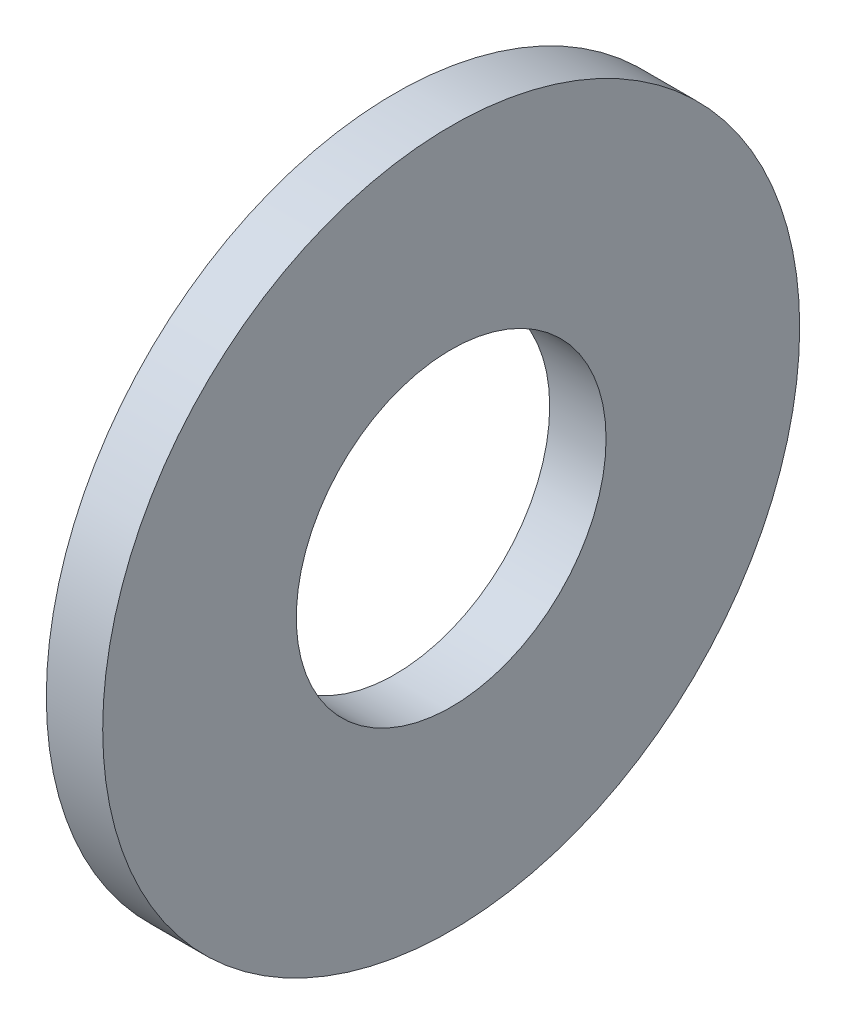
ISO-10303-21;
HEADER;
FILE_DESCRIPTION(('STEP AP214'),'2;1');
FILE_NAME('part.step','',(''),(''),'','','');
FILE_SCHEMA(('AUTOMOTIVE_DESIGN { 1 0 10303 214 1 1 1 1 }'));
ENDSEC;
DATA;
#1=APPLICATION_CONTEXT('core data for automotive mechanical design processes');
#2=APPLICATION_PROTOCOL_DEFINITION('international standard','automotive_design',2000,#1);
#3=PRODUCT_CONTEXT('',#1,'mechanical');
#4=PRODUCT('Part','Part','',(#3));
#5=PRODUCT_RELATED_PRODUCT_CATEGORY('part','',(#4));
#6=PRODUCT_DEFINITION_FORMATION('','',#4);
#7=PRODUCT_DEFINITION_CONTEXT('part definition',#1,'design');
#8=PRODUCT_DEFINITION('design','',#6,#7);
#9=PRODUCT_DEFINITION_SHAPE('','',#8);
#10=(LENGTH_UNIT() NAMED_UNIT(*) SI_UNIT(.MILLI.,.METRE.));
#11=(NAMED_UNIT(*) PLANE_ANGLE_UNIT() SI_UNIT($,.RADIAN.));
#12=(NAMED_UNIT(*) SI_UNIT($,.STERADIAN.) SOLID_ANGLE_UNIT());
#13=UNCERTAINTY_MEASURE_WITH_UNIT(LENGTH_MEASURE(1.E-05),#10,'distance_accuracy_value','');
#14=(GEOMETRIC_REPRESENTATION_CONTEXT(3) GLOBAL_UNCERTAINTY_ASSIGNED_CONTEXT((#13)) GLOBAL_UNIT_ASSIGNED_CONTEXT((#10,
#11,#12)) REPRESENTATION_CONTEXT('',''));
#15=CARTESIAN_POINT('',(0.,0.,0.));
#16=DIRECTION('',(0.,0.,1.));
#17=DIRECTION('',(1.,0.,0.));
#18=AXIS2_PLACEMENT_3D('',#15,#16,#17);
#19=CARTESIAN_POINT('',(2.3114,0.,0.));
#20=DIRECTION('',(1.,0.,0.));
#21=DIRECTION('',(0.,0.,-1.));
#22=AXIS2_PLACEMENT_3D('',#19,#20,#21);
#23=PLANE('',#22);
#24=CARTESIAN_POINT('',(2.3114,0.,0.));
#25=DIRECTION('',(1.,0.,0.));
#26=DIRECTION('',(0.,0.,-1.));
#27=AXIS2_PLACEMENT_3D('',#24,#25,#26);
#28=CIRCLE('',#27,14.2875);
#29=CARTESIAN_POINT('',(2.3114,0.,-14.2875));
#30=VERTEX_POINT('',#29);
#31=EDGE_CURVE('E10',#30,#30,#28,.T.);
#32=ORIENTED_EDGE('',*,*,#31,.T.);
#33=EDGE_LOOP('',(#32));
#34=FACE_BOUND('',#33,.T.);
#35=CARTESIAN_POINT('',(2.3114,0.,0.));
#36=DIRECTION('',(1.,0.,0.));
#37=DIRECTION('',(0.,0.,-1.));
#38=AXIS2_PLACEMENT_3D('',#35,#36,#37);
#39=CIRCLE('',#38,6.35);
#40=CARTESIAN_POINT('',(2.3114,0.,-6.35));
#41=VERTEX_POINT('',#40);
#42=EDGE_CURVE('E45',#41,#41,#39,.T.);
#43=ORIENTED_EDGE('',*,*,#42,.F.);
#44=EDGE_LOOP('',(#43));
#45=FACE_BOUND('',#44,.T.);
#46=ADVANCED_FACE('F34',(#34,#45),#23,.T.);
#47=CARTESIAN_POINT('',(0.,0.,0.));
#48=DIRECTION('',(1.,0.,0.));
#49=DIRECTION('',(0.,0.,-1.));
#50=AXIS2_PLACEMENT_3D('',#47,#48,#49);
#51=PLANE('',#50);
#52=CARTESIAN_POINT('',(0.,0.,0.));
#53=DIRECTION('',(1.,0.,0.));
#54=DIRECTION('',(0.,0.,-1.));
#55=AXIS2_PLACEMENT_3D('',#52,#53,#54);
#56=CIRCLE('',#55,14.2875);
#57=CARTESIAN_POINT('',(0.,0.,-14.2875));
#58=VERTEX_POINT('',#57);
#59=EDGE_CURVE('E38',#58,#58,#56,.T.);
#60=ORIENTED_EDGE('',*,*,#59,.F.);
#61=EDGE_LOOP('',(#60));
#62=FACE_BOUND('',#61,.T.);
#63=CARTESIAN_POINT('',(0.,0.,0.));
#64=DIRECTION('',(1.,0.,0.));
#65=DIRECTION('',(0.,0.,-1.));
#66=AXIS2_PLACEMENT_3D('',#63,#64,#65);
#67=CIRCLE('',#66,6.35);
#68=CARTESIAN_POINT('',(0.,0.,-6.35));
#69=VERTEX_POINT('',#68);
#70=EDGE_CURVE('E47',#69,#69,#67,.T.);
#71=ORIENTED_EDGE('',*,*,#70,.T.);
#72=EDGE_LOOP('',(#71));
#73=FACE_BOUND('',#72,.T.);
#74=ADVANCED_FACE('F57',(#62,#73),#51,.F.);
#75=CARTESIAN_POINT('',(2.3114,0.,0.));
#76=DIRECTION('',(-1.,0.,0.));
#77=DIRECTION('',(0.,0.,1.));
#78=AXIS2_PLACEMENT_3D('',#75,#76,#77);
#79=CYLINDRICAL_SURFACE('',#78,14.2875);
#80=ORIENTED_EDGE('',*,*,#31,.F.);
#81=EDGE_LOOP('',(#80));
#82=FACE_BOUND('',#81,.T.);
#83=ORIENTED_EDGE('',*,*,#59,.T.);
#84=EDGE_LOOP('',(#83));
#85=FACE_BOUND('',#84,.T.);
#86=ADVANCED_FACE('F36',(#82,#85),#79,.T.);
#87=CARTESIAN_POINT('',(2.3114,0.,0.));
#88=DIRECTION('',(-1.,0.,0.));
#89=DIRECTION('',(0.,0.,1.));
#90=AXIS2_PLACEMENT_3D('',#87,#88,#89);
#91=CYLINDRICAL_SURFACE('',#90,6.35);
#92=ORIENTED_EDGE('',*,*,#42,.T.);
#93=EDGE_LOOP('',(#92));
#94=FACE_BOUND('',#93,.T.);
#95=ORIENTED_EDGE('',*,*,#70,.F.);
#96=EDGE_LOOP('',(#95));
#97=FACE_BOUND('',#96,.T.);
#98=ADVANCED_FACE('F53',(#94,#97),#91,.F.);
#99=CLOSED_SHELL('',(#46,#74,#86,#98));
#100=MANIFOLD_SOLID_BREP('B2',#99);
#101=ADVANCED_BREP_SHAPE_REPRESENTATION('',(#18,#100),#14);
#102=SHAPE_DEFINITION_REPRESENTATION(#9,#101);
ENDSEC;
END-ISO-10303-21;
